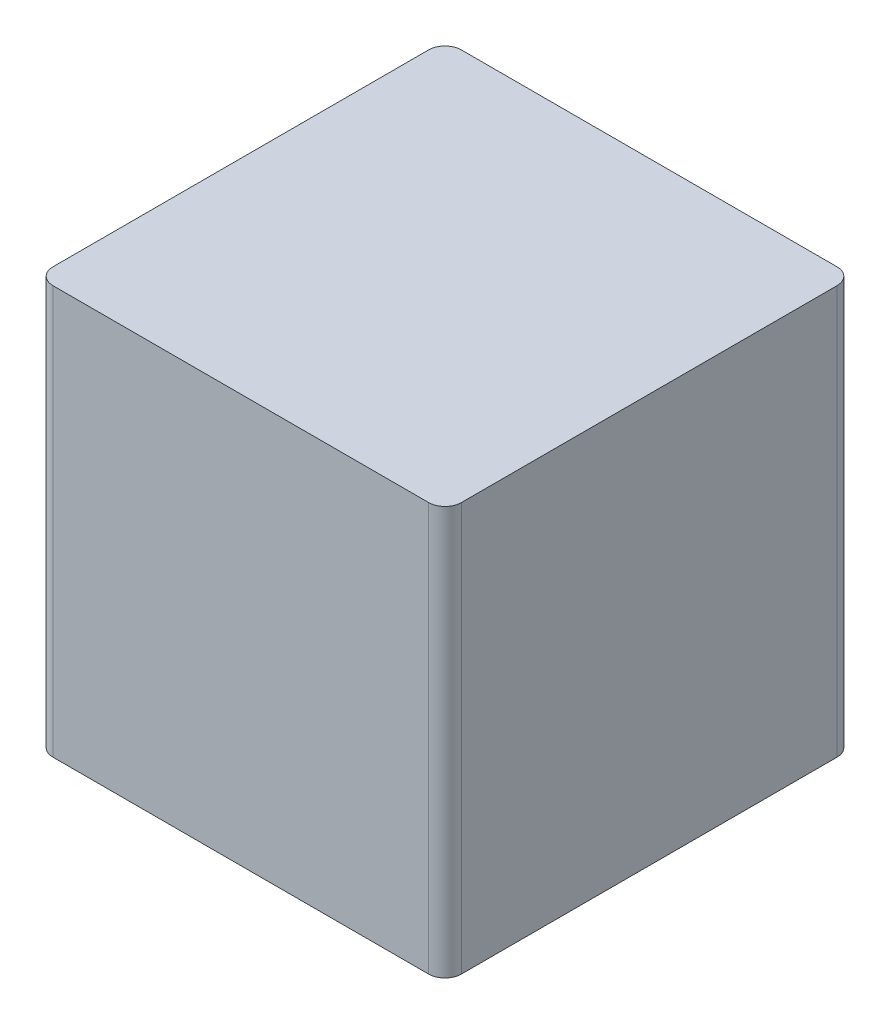
ISO-10303-21;
HEADER;
FILE_DESCRIPTION(('STEP AP214'),'2;1');
FILE_NAME('part.step','',(''),(''),'','','');
FILE_SCHEMA(('AUTOMOTIVE_DESIGN { 1 0 10303 214 1 1 1 1 }'));
ENDSEC;
DATA;
#1=APPLICATION_CONTEXT('core data for automotive mechanical design processes');
#2=APPLICATION_PROTOCOL_DEFINITION('international standard','automotive_design',2000,#1);
#3=PRODUCT_CONTEXT('',#1,'mechanical');
#4=PRODUCT('Part','Part','',(#3));
#5=PRODUCT_RELATED_PRODUCT_CATEGORY('part','',(#4));
#6=PRODUCT_DEFINITION_FORMATION('','',#4);
#7=PRODUCT_DEFINITION_CONTEXT('part definition',#1,'design');
#8=PRODUCT_DEFINITION('design','',#6,#7);
#9=PRODUCT_DEFINITION_SHAPE('','',#8);
#10=(LENGTH_UNIT() NAMED_UNIT(*) SI_UNIT(.MILLI.,.METRE.));
#11=(NAMED_UNIT(*) PLANE_ANGLE_UNIT() SI_UNIT($,.RADIAN.));
#12=(NAMED_UNIT(*) SI_UNIT($,.STERADIAN.) SOLID_ANGLE_UNIT());
#13=UNCERTAINTY_MEASURE_WITH_UNIT(LENGTH_MEASURE(1.E-05),#10,'distance_accuracy_value','');
#14=(GEOMETRIC_REPRESENTATION_CONTEXT(3) GLOBAL_UNCERTAINTY_ASSIGNED_CONTEXT((#13)) GLOBAL_UNIT_ASSIGNED_CONTEXT((#10,
#11,#12)) REPRESENTATION_CONTEXT('',''));
#15=CARTESIAN_POINT('',(0.,0.,0.));
#16=DIRECTION('',(0.,0.,1.));
#17=DIRECTION('',(1.,0.,0.));
#18=AXIS2_PLACEMENT_3D('',#15,#16,#17);
#19=CARTESIAN_POINT('',(-0.25,-0.25,0.25));
#20=DIRECTION('',(0.,1.,0.));
#21=DIRECTION('',(0.,0.,1.));
#22=AXIS2_PLACEMENT_3D('',#19,#20,#21);
#23=PLANE('',#22);
#24=CARTESIAN_POINT('',(-0.23,-0.25,0.23));
#25=DIRECTION('',(0.,-1.,0.));
#26=DIRECTION('',(0.,0.,-1.));
#27=AXIS2_PLACEMENT_3D('',#24,#25,#26);
#28=CIRCLE('',#27,0.02);
#29=CARTESIAN_POINT('',(-0.25,-0.25,0.23));
#30=VERTEX_POINT('',#29);
#31=CARTESIAN_POINT('',(-0.23,-0.25,0.25));
#32=VERTEX_POINT('',#31);
#33=EDGE_CURVE('E124',#30,#32,#28,.F.);
#34=ORIENTED_EDGE('',*,*,#33,.F.);
#35=DIRECTION('',(0.,0.,-1.));
#36=VECTOR('',#35,1.);
#37=CARTESIAN_POINT('',(-0.25,-0.25,0.25));
#38=LINE('',#37,#36);
#39=CARTESIAN_POINT('',(-0.25,-0.25,-0.23));
#40=VERTEX_POINT('',#39);
#41=EDGE_CURVE('E82',#30,#40,#38,.T.);
#42=ORIENTED_EDGE('',*,*,#41,.T.);
#43=CARTESIAN_POINT('',(-0.23,-0.25,-0.23));
#44=DIRECTION('',(0.,1.,0.));
#45=DIRECTION('',(0.,0.,1.));
#46=AXIS2_PLACEMENT_3D('',#43,#44,#45);
#47=CIRCLE('',#46,0.02);
#48=CARTESIAN_POINT('',(-0.23,-0.25,-0.25));
#49=VERTEX_POINT('',#48);
#50=EDGE_CURVE('E19',#49,#40,#47,.T.);
#51=ORIENTED_EDGE('',*,*,#50,.F.);
#52=DIRECTION('',(1.,0.,0.));
#53=VECTOR('',#52,1.);
#54=CARTESIAN_POINT('',(-0.25,-0.25,-0.25));
#55=LINE('',#54,#53);
#56=CARTESIAN_POINT('',(0.23,-0.25,-0.25));
#57=VERTEX_POINT('',#56);
#58=EDGE_CURVE('E80',#49,#57,#55,.T.);
#59=ORIENTED_EDGE('',*,*,#58,.T.);
#60=CARTESIAN_POINT('',(0.23,-0.25,-0.23));
#61=DIRECTION('',(0.,-1.,0.));
#62=DIRECTION('',(0.,0.,-1.));
#63=AXIS2_PLACEMENT_3D('',#60,#61,#62);
#64=CIRCLE('',#63,0.02);
#65=CARTESIAN_POINT('',(0.25,-0.25,-0.23));
#66=VERTEX_POINT('',#65);
#67=EDGE_CURVE('E93',#66,#57,#64,.F.);
#68=ORIENTED_EDGE('',*,*,#67,.F.);
#69=DIRECTION('',(0.,0.,1.));
#70=VECTOR('',#69,1.);
#71=CARTESIAN_POINT('',(0.25,-0.25,0.25));
#72=LINE('',#71,#70);
#73=CARTESIAN_POINT('',(0.25,-0.25,0.23));
#74=VERTEX_POINT('',#73);
#75=EDGE_CURVE('E107',#66,#74,#72,.T.);
#76=ORIENTED_EDGE('',*,*,#75,.T.);
#77=CARTESIAN_POINT('',(0.23,-0.25,0.23));
#78=DIRECTION('',(0.,1.,0.));
#79=DIRECTION('',(0.,0.,1.));
#80=AXIS2_PLACEMENT_3D('',#77,#78,#79);
#81=CIRCLE('',#80,0.02);
#82=CARTESIAN_POINT('',(0.23,-0.25,0.25));
#83=VERTEX_POINT('',#82);
#84=EDGE_CURVE('E109',#83,#74,#81,.T.);
#85=ORIENTED_EDGE('',*,*,#84,.F.);
#86=DIRECTION('',(1.,0.,0.));
#87=VECTOR('',#86,1.);
#88=CARTESIAN_POINT('',(-0.25,-0.25,0.25));
#89=LINE('',#88,#87);
#90=EDGE_CURVE('E103',#32,#83,#89,.T.);
#91=ORIENTED_EDGE('',*,*,#90,.F.);
#92=EDGE_LOOP('',(#34,#42,#51,#59,#68,#76,#85,#91));
#93=FACE_BOUND('',#92,.T.);
#94=ADVANCED_FACE('F16',(#93),#23,.F.);
#95=CARTESIAN_POINT('',(-0.23,0.25,-0.23));
#96=DIRECTION('',(0.,1.,0.));
#97=DIRECTION('',(0.,0.,1.));
#98=AXIS2_PLACEMENT_3D('',#95,#96,#97);
#99=CYLINDRICAL_SURFACE('',#98,0.02);
#100=ORIENTED_EDGE('',*,*,#50,.T.);
#101=DIRECTION('',(0.,1.,0.));
#102=VECTOR('',#101,1.);
#103=CARTESIAN_POINT('',(-0.25,0.25,-0.23));
#104=LINE('',#103,#102);
#105=CARTESIAN_POINT('',(-0.25,0.25,-0.23));
#106=VERTEX_POINT('',#105);
#107=EDGE_CURVE('E134',#40,#106,#104,.T.);
#108=ORIENTED_EDGE('',*,*,#107,.T.);
#109=CARTESIAN_POINT('',(-0.23,0.25,-0.23));
#110=DIRECTION('',(0.,1.,0.));
#111=DIRECTION('',(0.,0.,1.));
#112=AXIS2_PLACEMENT_3D('',#109,#110,#111);
#113=CIRCLE('',#112,0.02);
#114=CARTESIAN_POINT('',(-0.23,0.25,-0.25));
#115=VERTEX_POINT('',#114);
#116=EDGE_CURVE('E97',#106,#115,#113,.F.);
#117=ORIENTED_EDGE('',*,*,#116,.T.);
#118=DIRECTION('',(0.,1.,0.));
#119=VECTOR('',#118,1.);
#120=CARTESIAN_POINT('',(-0.23,-0.25,-0.25));
#121=LINE('',#120,#119);
#122=EDGE_CURVE('E87',#115,#49,#121,.F.);
#123=ORIENTED_EDGE('',*,*,#122,.T.);
#124=EDGE_LOOP('',(#100,#108,#117,#123));
#125=FACE_BOUND('',#124,.T.);
#126=ADVANCED_FACE('F96',(#125),#99,.T.);
#127=CARTESIAN_POINT('',(-0.25,-0.25,-0.25));
#128=DIRECTION('',(0.,0.,1.));
#129=DIRECTION('',(1.,0.,0.));
#130=AXIS2_PLACEMENT_3D('',#127,#128,#129);
#131=PLANE('',#130);
#132=ORIENTED_EDGE('',*,*,#122,.F.);
#133=DIRECTION('',(1.,0.,0.));
#134=VECTOR('',#133,1.);
#135=CARTESIAN_POINT('',(0.25,0.25,-0.25));
#136=LINE('',#135,#134);
#137=CARTESIAN_POINT('',(0.23,0.25,-0.25));
#138=VERTEX_POINT('',#137);
#139=EDGE_CURVE('E122',#115,#138,#136,.T.);
#140=ORIENTED_EDGE('',*,*,#139,.T.);
#141=DIRECTION('',(0.,-1.,0.));
#142=VECTOR('',#141,1.);
#143=CARTESIAN_POINT('',(0.23,-0.25,-0.25));
#144=LINE('',#143,#142);
#145=EDGE_CURVE('E92',#57,#138,#144,.F.);
#146=ORIENTED_EDGE('',*,*,#145,.F.);
#147=ORIENTED_EDGE('',*,*,#58,.F.);
#148=EDGE_LOOP('',(#132,#140,#146,#147));
#149=FACE_BOUND('',#148,.T.);
#150=ADVANCED_FACE('F89',(#149),#131,.F.);
#151=CARTESIAN_POINT('',(0.23,-0.25,-0.23));
#152=DIRECTION('',(0.,-1.,0.));
#153=DIRECTION('',(0.,0.,-1.));
#154=AXIS2_PLACEMENT_3D('',#151,#152,#153);
#155=CYLINDRICAL_SURFACE('',#154,0.02);
#156=CARTESIAN_POINT('',(0.23,0.25,-0.23));
#157=DIRECTION('',(0.,-1.,0.));
#158=DIRECTION('',(0.,0.,-1.));
#159=AXIS2_PLACEMENT_3D('',#156,#157,#158);
#160=CIRCLE('',#159,0.02);
#161=CARTESIAN_POINT('',(0.25,0.25,-0.23));
#162=VERTEX_POINT('',#161);
#163=EDGE_CURVE('E119',#138,#162,#160,.T.);
#164=ORIENTED_EDGE('',*,*,#163,.T.);
#165=DIRECTION('',(0.,1.,0.));
#166=VECTOR('',#165,1.);
#167=CARTESIAN_POINT('',(0.25,-0.25,-0.23));
#168=LINE('',#167,#166);
#169=EDGE_CURVE('E110',#162,#66,#168,.F.);
#170=ORIENTED_EDGE('',*,*,#169,.T.);
#171=ORIENTED_EDGE('',*,*,#67,.T.);
#172=ORIENTED_EDGE('',*,*,#145,.T.);
#173=EDGE_LOOP('',(#164,#170,#171,#172));
#174=FACE_BOUND('',#173,.T.);
#175=ADVANCED_FACE('F158',(#174),#155,.T.);
#176=CARTESIAN_POINT('',(0.25,-0.25,0.25));
#177=DIRECTION('',(-1.,0.,0.));
#178=DIRECTION('',(0.,0.,1.));
#179=AXIS2_PLACEMENT_3D('',#176,#177,#178);
#180=PLANE('',#179);
#181=ORIENTED_EDGE('',*,*,#169,.F.);
#182=DIRECTION('',(0.,0.,1.));
#183=VECTOR('',#182,1.);
#184=CARTESIAN_POINT('',(0.25,0.25,0.25));
#185=LINE('',#184,#183);
#186=CARTESIAN_POINT('',(0.25,0.25,0.23));
#187=VERTEX_POINT('',#186);
#188=EDGE_CURVE('E118',#162,#187,#185,.T.);
#189=ORIENTED_EDGE('',*,*,#188,.T.);
#190=DIRECTION('',(0.,1.,0.));
#191=VECTOR('',#190,1.);
#192=CARTESIAN_POINT('',(0.25,-0.25,0.23));
#193=LINE('',#192,#191);
#194=EDGE_CURVE('E106',#74,#187,#193,.T.);
#195=ORIENTED_EDGE('',*,*,#194,.F.);
#196=ORIENTED_EDGE('',*,*,#75,.F.);
#197=EDGE_LOOP('',(#181,#189,#195,#196));
#198=FACE_BOUND('',#197,.T.);
#199=ADVANCED_FACE('F157',(#198),#180,.F.);
#200=CARTESIAN_POINT('',(0.23,-0.25,0.23));
#201=DIRECTION('',(0.,1.,0.));
#202=DIRECTION('',(0.,0.,1.));
#203=AXIS2_PLACEMENT_3D('',#200,#201,#202);
#204=CYLINDRICAL_SURFACE('',#203,0.02);
#205=CARTESIAN_POINT('',(0.23,0.25,0.23));
#206=DIRECTION('',(0.,1.,0.));
#207=DIRECTION('',(0.,0.,1.));
#208=AXIS2_PLACEMENT_3D('',#205,#206,#207);
#209=CIRCLE('',#208,0.02);
#210=CARTESIAN_POINT('',(0.23,0.25,0.25));
#211=VERTEX_POINT('',#210);
#212=EDGE_CURVE('E115',#187,#211,#209,.F.);
#213=ORIENTED_EDGE('',*,*,#212,.T.);
#214=DIRECTION('',(0.,1.,0.));
#215=VECTOR('',#214,1.);
#216=CARTESIAN_POINT('',(0.23,-0.25,0.25));
#217=LINE('',#216,#215);
#218=EDGE_CURVE('E105',#83,#211,#217,.T.);
#219=ORIENTED_EDGE('',*,*,#218,.F.);
#220=ORIENTED_EDGE('',*,*,#84,.T.);
#221=ORIENTED_EDGE('',*,*,#194,.T.);
#222=EDGE_LOOP('',(#213,#219,#220,#221));
#223=FACE_BOUND('',#222,.T.);
#224=ADVANCED_FACE('F152',(#223),#204,.T.);
#225=CARTESIAN_POINT('',(-0.25,-0.25,0.25));
#226=DIRECTION('',(0.,0.,1.));
#227=DIRECTION('',(1.,0.,0.));
#228=AXIS2_PLACEMENT_3D('',#225,#226,#227);
#229=PLANE('',#228);
#230=ORIENTED_EDGE('',*,*,#90,.T.);
#231=ORIENTED_EDGE('',*,*,#218,.T.);
#232=DIRECTION('',(1.,0.,0.));
#233=VECTOR('',#232,1.);
#234=CARTESIAN_POINT('',(0.25,0.25,0.25));
#235=LINE('',#234,#233);
#236=CARTESIAN_POINT('',(-0.23,0.25,0.25));
#237=VERTEX_POINT('',#236);
#238=EDGE_CURVE('E114',#211,#237,#235,.F.);
#239=ORIENTED_EDGE('',*,*,#238,.T.);
#240=DIRECTION('',(0.,-1.,0.));
#241=VECTOR('',#240,1.);
#242=CARTESIAN_POINT('',(-0.23,-0.25,0.25));
#243=LINE('',#242,#241);
#244=EDGE_CURVE('E126',#32,#237,#243,.F.);
#245=ORIENTED_EDGE('',*,*,#244,.F.);
#246=EDGE_LOOP('',(#230,#231,#239,#245));
#247=FACE_BOUND('',#246,.T.);
#248=ADVANCED_FACE('F144',(#247),#229,.T.);
#249=CARTESIAN_POINT('',(-0.23,-0.25,0.23));
#250=DIRECTION('',(0.,-1.,0.));
#251=DIRECTION('',(0.,0.,-1.));
#252=AXIS2_PLACEMENT_3D('',#249,#250,#251);
#253=CYLINDRICAL_SURFACE('',#252,0.02);
#254=ORIENTED_EDGE('',*,*,#33,.T.);
#255=ORIENTED_EDGE('',*,*,#244,.T.);
#256=CARTESIAN_POINT('',(-0.23,0.25,0.23));
#257=DIRECTION('',(0.,-1.,0.));
#258=DIRECTION('',(0.,0.,-1.));
#259=AXIS2_PLACEMENT_3D('',#256,#257,#258);
#260=CIRCLE('',#259,0.02);
#261=CARTESIAN_POINT('',(-0.25,0.25,0.23));
#262=VERTEX_POINT('',#261);
#263=EDGE_CURVE('E25',#237,#262,#260,.T.);
#264=ORIENTED_EDGE('',*,*,#263,.T.);
#265=DIRECTION('',(0.,1.,0.));
#266=VECTOR('',#265,1.);
#267=CARTESIAN_POINT('',(-0.25,0.25,0.23));
#268=LINE('',#267,#266);
#269=EDGE_CURVE('E33',#262,#30,#268,.F.);
#270=ORIENTED_EDGE('',*,*,#269,.T.);
#271=EDGE_LOOP('',(#254,#255,#264,#270));
#272=FACE_BOUND('',#271,.T.);
#273=ADVANCED_FACE('F174',(#272),#253,.T.);
#274=CARTESIAN_POINT('',(-0.25,0.25,0.25));
#275=DIRECTION('',(1.,0.,0.));
#276=DIRECTION('',(0.,0.,-1.));
#277=AXIS2_PLACEMENT_3D('',#274,#275,#276);
#278=PLANE('',#277);
#279=ORIENTED_EDGE('',*,*,#269,.F.);
#280=DIRECTION('',(0.,0.,1.));
#281=VECTOR('',#280,1.);
#282=CARTESIAN_POINT('',(-0.25,0.25,0.25));
#283=LINE('',#282,#281);
#284=EDGE_CURVE('E11',#262,#106,#283,.F.);
#285=ORIENTED_EDGE('',*,*,#284,.T.);
#286=ORIENTED_EDGE('',*,*,#107,.F.);
#287=ORIENTED_EDGE('',*,*,#41,.F.);
#288=EDGE_LOOP('',(#279,#285,#286,#287));
#289=FACE_BOUND('',#288,.T.);
#290=ADVANCED_FACE('F169',(#289),#278,.F.);
#291=CARTESIAN_POINT('',(0.25,0.25,0.25));
#292=DIRECTION('',(0.,-1.,0.));
#293=DIRECTION('',(1.,0.,0.));
#294=AXIS2_PLACEMENT_3D('',#291,#292,#293);
#295=PLANE('',#294);
#296=ORIENTED_EDGE('',*,*,#263,.F.);
#297=ORIENTED_EDGE('',*,*,#238,.F.);
#298=ORIENTED_EDGE('',*,*,#212,.F.);
#299=ORIENTED_EDGE('',*,*,#188,.F.);
#300=ORIENTED_EDGE('',*,*,#163,.F.);
#301=ORIENTED_EDGE('',*,*,#139,.F.);
#302=ORIENTED_EDGE('',*,*,#116,.F.);
#303=ORIENTED_EDGE('',*,*,#284,.F.);
#304=EDGE_LOOP('',(#296,#297,#298,#299,#300,#301,#302,#303));
#305=FACE_BOUND('',#304,.T.);
#306=ADVANCED_FACE('F149',(#305),#295,.F.);
#307=CLOSED_SHELL('',(#94,#126,#150,#175,#199,#224,#248,#273,#290,#306));
#308=MANIFOLD_SOLID_BREP('B1',#307);
#309=ADVANCED_BREP_SHAPE_REPRESENTATION('',(#18,#308),#14);
#310=SHAPE_DEFINITION_REPRESENTATION(#9,#309);
ENDSEC;
END-ISO-10303-21;
